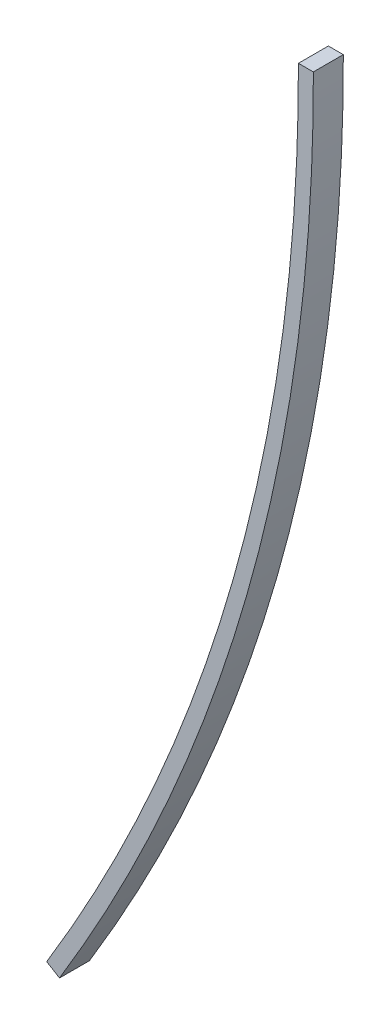
ISO-10303-21;
HEADER;
FILE_DESCRIPTION(('STEP AP214'),'2;1');
FILE_NAME('part.step','',(''),(''),'','','');
FILE_SCHEMA(('AUTOMOTIVE_DESIGN { 1 0 10303 214 1 1 1 1 }'));
ENDSEC;
DATA;
#1=APPLICATION_CONTEXT('core data for automotive mechanical design processes');
#2=APPLICATION_PROTOCOL_DEFINITION('international standard','automotive_design',2000,#1);
#3=PRODUCT_CONTEXT('',#1,'mechanical');
#4=PRODUCT('Part','Part','',(#3));
#5=PRODUCT_RELATED_PRODUCT_CATEGORY('part','',(#4));
#6=PRODUCT_DEFINITION_FORMATION('','',#4);
#7=PRODUCT_DEFINITION_CONTEXT('part definition',#1,'design');
#8=PRODUCT_DEFINITION('design','',#6,#7);
#9=PRODUCT_DEFINITION_SHAPE('','',#8);
#10=(LENGTH_UNIT() NAMED_UNIT(*) SI_UNIT(.MILLI.,.METRE.));
#11=(NAMED_UNIT(*) PLANE_ANGLE_UNIT() SI_UNIT($,.RADIAN.));
#12=(NAMED_UNIT(*) SI_UNIT($,.STERADIAN.) SOLID_ANGLE_UNIT());
#13=UNCERTAINTY_MEASURE_WITH_UNIT(LENGTH_MEASURE(1.E-05),#10,'distance_accuracy_value','');
#14=(GEOMETRIC_REPRESENTATION_CONTEXT(3) GLOBAL_UNCERTAINTY_ASSIGNED_CONTEXT((#13)) GLOBAL_UNIT_ASSIGNED_CONTEXT((#10,
#11,#12)) REPRESENTATION_CONTEXT('',''));
#15=CARTESIAN_POINT('',(0.,0.,0.));
#16=DIRECTION('',(0.,0.,1.));
#17=DIRECTION('',(1.,0.,0.));
#18=AXIS2_PLACEMENT_3D('',#15,#16,#17);
#19=CARTESIAN_POINT('',(0.,0.,6.35));
#20=CARTESIAN_POINT('',(54.0830680351684,89.2876048986792,6.35));
#21=CARTESIAN_POINT('',(53.8116404194646,193.244523997024,6.35));
#22=B_SPLINE_CURVE_WITH_KNOTS('',2,(#19,#20,#21),.UNSPECIFIED.,.F.,.F.,(3,3),(0.,1.),.UNSPECIFIED.);
#23=DIRECTION('',(0.,0.,-1.));
#24=VECTOR('',#23,1.);
#25=SURFACE_OF_LINEAR_EXTRUSION('',#22,#24);
#26=CARTESIAN_POINT('',(0.,0.,0.));
#27=CARTESIAN_POINT('',(54.0830680351684,89.2876048986792,0.));
#28=CARTESIAN_POINT('',(53.8116404194646,193.244523997024,0.));
#29=B_SPLINE_CURVE_WITH_KNOTS('',2,(#26,#27,#28),.UNSPECIFIED.,.F.,.F.,(3,3),(0.,1.),.UNSPECIFIED.);
#30=CARTESIAN_POINT('',(0.,0.,0.));
#31=VERTEX_POINT('',#30);
#32=CARTESIAN_POINT('',(53.8116404194646,193.244523997024,0.));
#33=VERTEX_POINT('',#32);
#34=EDGE_CURVE('E113',#31,#33,#29,.T.);
#35=ORIENTED_EDGE('',*,*,#34,.T.);
#36=DIRECTION('',(0.,0.,-1.));
#37=VECTOR('',#36,1.);
#38=CARTESIAN_POINT('',(53.8116404194646,193.244523997024,6.35));
#39=LINE('',#38,#37);
#40=CARTESIAN_POINT('',(53.8116404194646,193.244523997024,6.35));
#41=VERTEX_POINT('',#40);
#42=EDGE_CURVE('E11',#41,#33,#39,.T.);
#43=ORIENTED_EDGE('',*,*,#42,.F.);
#44=CARTESIAN_POINT('',(0.,0.,6.35));
#45=VERTEX_POINT('',#44);
#46=EDGE_CURVE('E74',#45,#41,#22,.T.);
#47=ORIENTED_EDGE('',*,*,#46,.F.);
#48=DIRECTION('',(0.,0.,-1.));
#49=VECTOR('',#48,1.);
#50=CARTESIAN_POINT('',(0.,0.,6.35));
#51=LINE('',#50,#49);
#52=EDGE_CURVE('E50',#45,#31,#51,.T.);
#53=ORIENTED_EDGE('',*,*,#52,.T.);
#54=EDGE_LOOP('',(#35,#43,#47,#53));
#55=FACE_BOUND('',#54,.T.);
#56=ADVANCED_FACE('F33',(#55),#25,.F.);
#57=CARTESIAN_POINT('',(50.6366512415954,193.236234219393,6.35));
#58=DIRECTION('',(-0.00261095358428153,0.999996591454881,0.));
#59=DIRECTION('',(-0.999996591454881,-0.00261095358428153,0.));
#60=AXIS2_PLACEMENT_3D('',#57,#58,#59);
#61=PLANE('',#60);
#62=DIRECTION('',(0.999996591454881,0.00261095358428153,0.));
#63=VECTOR('',#62,1.);
#64=CARTESIAN_POINT('',(50.6366512415954,193.236234219393,0.));
#65=LINE('',#64,#63);
#66=CARTESIAN_POINT('',(50.6366512415954,193.236234219393,0.));
#67=VERTEX_POINT('',#66);
#68=EDGE_CURVE('E83',#67,#33,#65,.T.);
#69=ORIENTED_EDGE('',*,*,#68,.F.);
#70=DIRECTION('',(0.,0.,-1.));
#71=VECTOR('',#70,1.);
#72=CARTESIAN_POINT('',(50.6366512415954,193.236234219393,6.35));
#73=LINE('',#72,#71);
#74=CARTESIAN_POINT('',(50.6366512415954,193.236234219393,6.35));
#75=VERTEX_POINT('',#74);
#76=EDGE_CURVE('E42',#75,#67,#73,.T.);
#77=ORIENTED_EDGE('',*,*,#76,.F.);
#78=DIRECTION('',(0.999996591454881,0.00261095358428153,0.));
#79=VECTOR('',#78,1.);
#80=CARTESIAN_POINT('',(50.6366512415954,193.236234219393,6.35));
#81=LINE('',#80,#79);
#82=EDGE_CURVE('E81',#75,#41,#81,.T.);
#83=ORIENTED_EDGE('',*,*,#82,.T.);
#84=ORIENTED_EDGE('',*,*,#42,.T.);
#85=EDGE_LOOP('',(#69,#77,#83,#84));
#86=FACE_BOUND('',#85,.T.);
#87=ADVANCED_FACE('F80',(#86),#61,.T.);
#88=CARTESIAN_POINT('',(-2.71566599008265,1.64492651213008,6.35));
#89=CARTESIAN_POINT('',(15.169966928095,31.1729356169872,6.35));
#90=CARTESIAN_POINT('',(28.5468878952703,61.8853643336687,6.35));
#91=CARTESIAN_POINT('',(46.3247453687016,125.727937768718,6.35));
#92=CARTESIAN_POINT('',(50.7264052341683,158.860408014444,6.35));
#93=CARTESIAN_POINT('',(50.6366512415954,193.236234219393,6.35));
#94=B_SPLINE_CURVE_WITH_KNOTS('',3,(#88,#89,#90,#91,#92,#93),.UNSPECIFIED.,.F.,.F.,(4,2,4),(0.,
0.5,1.),.UNSPECIFIED.);
#95=DIRECTION('',(0.,0.,-1.));
#96=VECTOR('',#95,1.);
#97=SURFACE_OF_LINEAR_EXTRUSION('',#94,#96);
#98=CARTESIAN_POINT('',(-2.71566599008265,1.64492651213008,0.));
#99=CARTESIAN_POINT('',(15.169966928095,31.1729356169872,0.));
#100=CARTESIAN_POINT('',(28.5468878952703,61.8853643336687,0.));
#101=CARTESIAN_POINT('',(46.3247453687016,125.727937768718,0.));
#102=CARTESIAN_POINT('',(50.7264052341683,158.860408014444,0.));
#103=CARTESIAN_POINT('',(50.6366512415954,193.236234219393,0.));
#104=B_SPLINE_CURVE_WITH_KNOTS('',3,(#98,#99,#100,#101,#102,#103),.UNSPECIFIED.,.F.,.F.,(4,2,4),
(0.,0.5,1.),.UNSPECIFIED.);
#105=CARTESIAN_POINT('',(-2.71566599008265,1.64492651213008,0.));
#106=VERTEX_POINT('',#105);
#107=EDGE_CURVE('E117',#106,#67,#104,.T.);
#108=ORIENTED_EDGE('',*,*,#107,.F.);
#109=DIRECTION('',(0.,0.,-1.));
#110=VECTOR('',#109,1.);
#111=CARTESIAN_POINT('',(-2.71566599008265,1.64492651213008,6.35));
#112=LINE('',#111,#110);
#113=CARTESIAN_POINT('',(-2.71566599008265,1.64492651213008,6.35));
#114=VERTEX_POINT('',#113);
#115=EDGE_CURVE('E63',#114,#106,#112,.T.);
#116=ORIENTED_EDGE('',*,*,#115,.F.);
#117=EDGE_CURVE('E89',#114,#75,#94,.T.);
#118=ORIENTED_EDGE('',*,*,#117,.T.);
#119=ORIENTED_EDGE('',*,*,#76,.T.);
#120=EDGE_LOOP('',(#108,#116,#118,#119));
#121=FACE_BOUND('',#120,.T.);
#122=ADVANCED_FACE('F91',(#121),#97,.T.);
#123=CARTESIAN_POINT('',(0.,0.,6.35));
#124=DIRECTION('',(-0.51808709043467,-0.855327870892173,0.));
#125=DIRECTION('',(0.855327870892173,-0.51808709043467,0.));
#126=AXIS2_PLACEMENT_3D('',#123,#124,#125);
#127=PLANE('',#126);
#128=DIRECTION('',(-0.855327870892173,0.51808709043467,0.));
#129=VECTOR('',#128,1.);
#130=CARTESIAN_POINT('',(0.,0.,0.));
#131=LINE('',#130,#129);
#132=EDGE_CURVE('E119',#31,#106,#131,.T.);
#133=ORIENTED_EDGE('',*,*,#132,.F.);
#134=ORIENTED_EDGE('',*,*,#52,.F.);
#135=DIRECTION('',(-0.855327870892173,0.51808709043467,0.));
#136=VECTOR('',#135,1.);
#137=CARTESIAN_POINT('',(0.,0.,6.35));
#138=LINE('',#137,#136);
#139=EDGE_CURVE('E92',#45,#114,#138,.T.);
#140=ORIENTED_EDGE('',*,*,#139,.T.);
#141=ORIENTED_EDGE('',*,*,#115,.T.);
#142=EDGE_LOOP('',(#133,#134,#140,#141));
#143=FACE_BOUND('',#142,.T.);
#144=ADVANCED_FACE('F105',(#143),#127,.T.);
#145=CARTESIAN_POINT('',(40.4944441224504,92.9549334485955,6.35));
#146=DIRECTION('',(0.,0.,-1.));
#147=DIRECTION('',(-1.,0.,0.));
#148=AXIS2_PLACEMENT_3D('',#145,#146,#147);
#149=PLANE('',#148);
#150=ORIENTED_EDGE('',*,*,#46,.T.);
#151=ORIENTED_EDGE('',*,*,#82,.F.);
#152=ORIENTED_EDGE('',*,*,#117,.F.);
#153=ORIENTED_EDGE('',*,*,#139,.F.);
#154=EDGE_LOOP('',(#150,#151,#152,#153));
#155=FACE_BOUND('',#154,.T.);
#156=ADVANCED_FACE('F88',(#155),#149,.F.);
#157=CARTESIAN_POINT('',(40.4944441224504,92.9549334485955,0.));
#158=DIRECTION('',(0.,0.,-1.));
#159=DIRECTION('',(-1.,0.,0.));
#160=AXIS2_PLACEMENT_3D('',#157,#158,#159);
#161=PLANE('',#160);
#162=ORIENTED_EDGE('',*,*,#34,.F.);
#163=ORIENTED_EDGE('',*,*,#132,.T.);
#164=ORIENTED_EDGE('',*,*,#107,.T.);
#165=ORIENTED_EDGE('',*,*,#68,.T.);
#166=EDGE_LOOP('',(#162,#163,#164,#165));
#167=FACE_BOUND('',#166,.T.);
#168=ADVANCED_FACE('F116',(#167),#161,.T.);
#169=CLOSED_SHELL('',(#56,#87,#122,#144,#156,#168));
#170=MANIFOLD_SOLID_BREP('B2',#169);
#171=ADVANCED_BREP_SHAPE_REPRESENTATION('',(#18,#170),#14);
#172=SHAPE_DEFINITION_REPRESENTATION(#9,#171);
ENDSEC;
END-ISO-10303-21;
